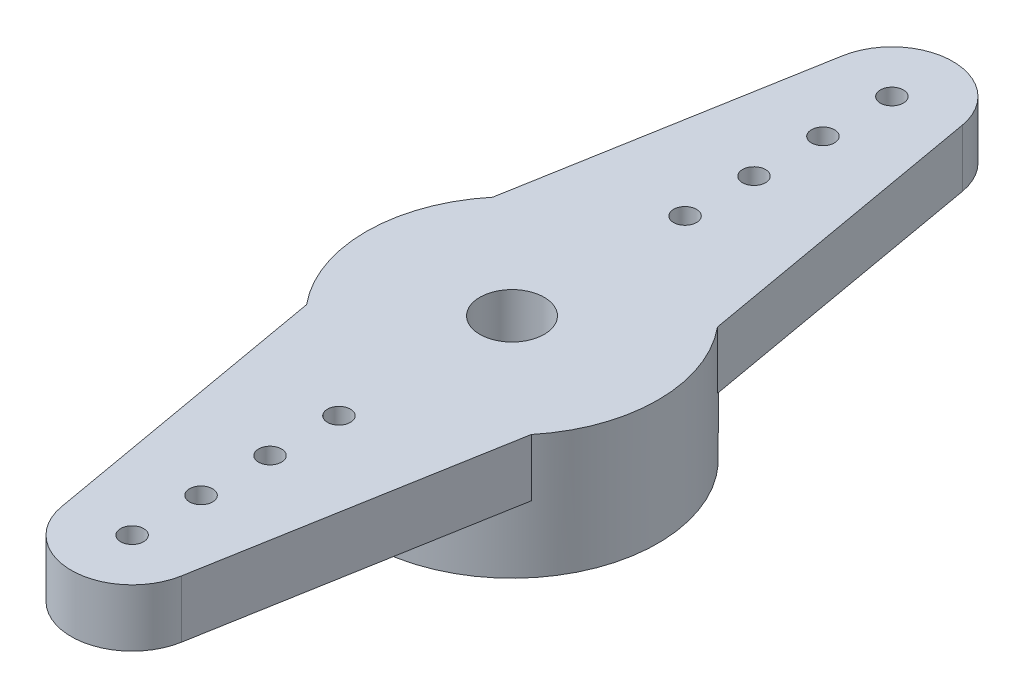
ISO-10303-21;
HEADER;
FILE_DESCRIPTION(('STEP AP214'),'2;1');
FILE_NAME('part.step','',(''),(''),'','','');
FILE_SCHEMA(('AUTOMOTIVE_DESIGN { 1 0 10303 214 1 1 1 1 }'));
ENDSEC;
DATA;
#1=APPLICATION_CONTEXT('core data for automotive mechanical design processes');
#2=APPLICATION_PROTOCOL_DEFINITION('international standard','automotive_design',2000,#1);
#3=PRODUCT_CONTEXT('',#1,'mechanical');
#4=PRODUCT('Part','Part','',(#3));
#5=PRODUCT_RELATED_PRODUCT_CATEGORY('part','',(#4));
#6=PRODUCT_DEFINITION_FORMATION('','',#4);
#7=PRODUCT_DEFINITION_CONTEXT('part definition',#1,'design');
#8=PRODUCT_DEFINITION('design','',#6,#7);
#9=PRODUCT_DEFINITION_SHAPE('','',#8);
#10=(LENGTH_UNIT() NAMED_UNIT(*) SI_UNIT(.MILLI.,.METRE.));
#11=(NAMED_UNIT(*) PLANE_ANGLE_UNIT() SI_UNIT($,.RADIAN.));
#12=(NAMED_UNIT(*) SI_UNIT($,.STERADIAN.) SOLID_ANGLE_UNIT());
#13=UNCERTAINTY_MEASURE_WITH_UNIT(LENGTH_MEASURE(1.E-05),#10,'distance_accuracy_value','');
#14=(GEOMETRIC_REPRESENTATION_CONTEXT(3) GLOBAL_UNCERTAINTY_ASSIGNED_CONTEXT((#13)) GLOBAL_UNIT_ASSIGNED_CONTEXT((#10,
#11,#12)) REPRESENTATION_CONTEXT('',''));
#15=CARTESIAN_POINT('',(0.,0.,0.));
#16=DIRECTION('',(0.,0.,1.));
#17=DIRECTION('',(1.,0.,0.));
#18=AXIS2_PLACEMENT_3D('',#15,#16,#17);
#19=CARTESIAN_POINT('',(0.,5.4,0.));
#20=DIRECTION('',(0.,-1.,0.));
#21=DIRECTION('',(0.,0.,-1.));
#22=AXIS2_PLACEMENT_3D('',#19,#20,#21);
#23=CYLINDRICAL_SURFACE('',#22,6.35);
#24=CARTESIAN_POINT('',(0.,0.,0.));
#25=DIRECTION('',(0.,1.,0.));
#26=DIRECTION('',(0.,0.,1.));
#27=AXIS2_PLACEMENT_3D('',#24,#25,#26);
#28=CIRCLE('',#27,6.35);
#29=CARTESIAN_POINT('',(0.,0.,6.35));
#30=VERTEX_POINT('',#29);
#31=EDGE_CURVE('E182',#30,#30,#28,.T.);
#32=ORIENTED_EDGE('',*,*,#31,.T.);
#33=EDGE_LOOP('',(#32));
#34=FACE_BOUND('',#33,.T.);
#35=DIRECTION('',(0.,1.,0.));
#36=VECTOR('',#35,1.);
#37=CARTESIAN_POINT('',(-4.89161268236577,2.9,4.04902770621767));
#38=LINE('',#37,#36);
#39=CARTESIAN_POINT('',(-4.89161268236577,2.9,4.04902770621767));
#40=VERTEX_POINT('',#39);
#41=CARTESIAN_POINT('',(-4.89161268236577,5.4,4.04902770621767));
#42=VERTEX_POINT('',#41);
#43=EDGE_CURVE('E136',#40,#42,#38,.T.);
#44=ORIENTED_EDGE('',*,*,#43,.T.);
#45=CARTESIAN_POINT('',(0.,5.4,0.));
#46=DIRECTION('',(0.,1.,0.));
#47=DIRECTION('',(0.,0.,1.));
#48=AXIS2_PLACEMENT_3D('',#45,#46,#47);
#49=CIRCLE('',#48,6.35);
#50=CARTESIAN_POINT('',(-4.89161268236577,5.4,-4.04902770621767));
#51=VERTEX_POINT('',#50);
#52=EDGE_CURVE('E11',#51,#42,#49,.T.);
#53=ORIENTED_EDGE('',*,*,#52,.F.);
#54=DIRECTION('',(0.,1.,0.));
#55=VECTOR('',#54,1.);
#56=CARTESIAN_POINT('',(-4.89161268236577,2.9,-4.04902770621767));
#57=LINE('',#56,#55);
#58=CARTESIAN_POINT('',(-4.89161268236577,2.9,-4.04902770621767));
#59=VERTEX_POINT('',#58);
#60=EDGE_CURVE('E186',#59,#51,#57,.T.);
#61=ORIENTED_EDGE('',*,*,#60,.F.);
#62=CARTESIAN_POINT('',(0.,2.9,0.));
#63=DIRECTION('',(0.,-1.,0.));
#64=DIRECTION('',(0.,0.,1.));
#65=AXIS2_PLACEMENT_3D('',#62,#63,#64);
#66=CIRCLE('',#65,6.35);
#67=CARTESIAN_POINT('',(4.89161268236577,2.9,-4.04902770621767));
#68=VERTEX_POINT('',#67);
#69=EDGE_CURVE('E169',#59,#68,#66,.T.);
#70=ORIENTED_EDGE('',*,*,#69,.T.);
#71=DIRECTION('',(0.,1.,0.));
#72=VECTOR('',#71,1.);
#73=CARTESIAN_POINT('',(4.89161268236577,2.9,-4.04902770621767));
#74=LINE('',#73,#72);
#75=CARTESIAN_POINT('',(4.89161268236577,5.4,-4.04902770621767));
#76=VERTEX_POINT('',#75);
#77=EDGE_CURVE('E183',#68,#76,#74,.T.);
#78=ORIENTED_EDGE('',*,*,#77,.T.);
#79=CARTESIAN_POINT('',(4.89161268236577,5.4,4.04902770621767));
#80=VERTEX_POINT('',#79);
#81=EDGE_CURVE('E41',#80,#76,#49,.T.);
#82=ORIENTED_EDGE('',*,*,#81,.F.);
#83=DIRECTION('',(0.,1.,0.));
#84=VECTOR('',#83,1.);
#85=CARTESIAN_POINT('',(4.89161268236577,2.9,4.04902770621767));
#86=LINE('',#85,#84);
#87=CARTESIAN_POINT('',(4.89161268236577,2.9,4.04902770621767));
#88=VERTEX_POINT('',#87);
#89=EDGE_CURVE('E115',#88,#80,#86,.T.);
#90=ORIENTED_EDGE('',*,*,#89,.F.);
#91=CARTESIAN_POINT('',(0.,2.9,0.));
#92=DIRECTION('',(0.,1.,0.));
#93=DIRECTION('',(0.,0.,-1.));
#94=AXIS2_PLACEMENT_3D('',#91,#92,#93);
#95=CIRCLE('',#94,6.35);
#96=EDGE_CURVE('E106',#40,#88,#95,.T.);
#97=ORIENTED_EDGE('',*,*,#96,.F.);
#98=EDGE_LOOP('',(#44,#53,#61,#70,#78,#82,#90,#97));
#99=FACE_BOUND('',#98,.T.);
#100=ADVANCED_FACE('F33',(#34,#99),#23,.T.);
#101=CARTESIAN_POINT('',(0.,5.4,0.));
#102=DIRECTION('',(0.,1.,0.));
#103=DIRECTION('',(0.,0.,1.));
#104=AXIS2_PLACEMENT_3D('',#101,#102,#103);
#105=PLANE('',#104);
#106=CARTESIAN_POINT('',(0.,5.4,7.53));
#107=DIRECTION('',(0.,1.,0.));
#108=DIRECTION('',(0.,0.,1.));
#109=AXIS2_PLACEMENT_3D('',#106,#107,#108);
#110=CIRCLE('',#109,0.5);
#111=CARTESIAN_POINT('',(0.,5.4,8.03));
#112=VERTEX_POINT('',#111);
#113=EDGE_CURVE('E215',#112,#112,#110,.T.);
#114=ORIENTED_EDGE('',*,*,#113,.F.);
#115=EDGE_LOOP('',(#114));
#116=FACE_BOUND('',#115,.T.);
#117=CARTESIAN_POINT('',(0.,5.4,10.53));
#118=DIRECTION('',(0.,1.,0.));
#119=DIRECTION('',(0.,0.,1.));
#120=AXIS2_PLACEMENT_3D('',#117,#118,#119);
#121=CIRCLE('',#120,0.5);
#122=CARTESIAN_POINT('',(0.,5.4,11.03));
#123=VERTEX_POINT('',#122);
#124=EDGE_CURVE('E206',#123,#123,#121,.T.);
#125=ORIENTED_EDGE('',*,*,#124,.F.);
#126=EDGE_LOOP('',(#125));
#127=FACE_BOUND('',#126,.T.);
#128=CARTESIAN_POINT('',(0.,5.4,13.53));
#129=DIRECTION('',(0.,1.,0.));
#130=DIRECTION('',(0.,0.,1.));
#131=AXIS2_PLACEMENT_3D('',#128,#129,#130);
#132=CIRCLE('',#131,0.5);
#133=CARTESIAN_POINT('',(0.,5.4,14.03));
#134=VERTEX_POINT('',#133);
#135=EDGE_CURVE('E203',#134,#134,#132,.T.);
#136=ORIENTED_EDGE('',*,*,#135,.F.);
#137=EDGE_LOOP('',(#136));
#138=FACE_BOUND('',#137,.T.);
#139=CARTESIAN_POINT('',(0.,5.4,16.53));
#140=DIRECTION('',(0.,1.,0.));
#141=DIRECTION('',(0.,0.,1.));
#142=AXIS2_PLACEMENT_3D('',#139,#140,#141);
#143=CIRCLE('',#142,0.5);
#144=CARTESIAN_POINT('',(0.,5.4,17.03));
#145=VERTEX_POINT('',#144);
#146=EDGE_CURVE('E125',#145,#145,#143,.T.);
#147=ORIENTED_EDGE('',*,*,#146,.F.);
#148=EDGE_LOOP('',(#147));
#149=FACE_BOUND('',#148,.T.);
#150=CARTESIAN_POINT('',(0.,5.4,-7.53));
#151=DIRECTION('',(0.,-1.,0.));
#152=DIRECTION('',(0.,0.,-1.));
#153=AXIS2_PLACEMENT_3D('',#150,#151,#152);
#154=CIRCLE('',#153,0.5);
#155=CARTESIAN_POINT('',(0.,5.4,-8.03));
#156=VERTEX_POINT('',#155);
#157=EDGE_CURVE('E135',#156,#156,#154,.T.);
#158=ORIENTED_EDGE('',*,*,#157,.T.);
#159=EDGE_LOOP('',(#158));
#160=FACE_BOUND('',#159,.T.);
#161=CARTESIAN_POINT('',(0.,5.4,-10.53));
#162=DIRECTION('',(0.,-1.,0.));
#163=DIRECTION('',(0.,0.,-1.));
#164=AXIS2_PLACEMENT_3D('',#161,#162,#163);
#165=CIRCLE('',#164,0.5);
#166=CARTESIAN_POINT('',(0.,5.4,-11.03));
#167=VERTEX_POINT('',#166);
#168=EDGE_CURVE('E143',#167,#167,#165,.T.);
#169=ORIENTED_EDGE('',*,*,#168,.T.);
#170=EDGE_LOOP('',(#169));
#171=FACE_BOUND('',#170,.T.);
#172=CARTESIAN_POINT('',(0.,5.4,-13.53));
#173=DIRECTION('',(0.,-1.,0.));
#174=DIRECTION('',(0.,0.,-1.));
#175=AXIS2_PLACEMENT_3D('',#172,#173,#174);
#176=CIRCLE('',#175,0.5);
#177=CARTESIAN_POINT('',(0.,5.4,-14.03));
#178=VERTEX_POINT('',#177);
#179=EDGE_CURVE('E147',#178,#178,#176,.T.);
#180=ORIENTED_EDGE('',*,*,#179,.T.);
#181=EDGE_LOOP('',(#180));
#182=FACE_BOUND('',#181,.T.);
#183=CARTESIAN_POINT('',(0.,5.4,-16.53));
#184=DIRECTION('',(0.,-1.,0.));
#185=DIRECTION('',(0.,0.,-1.));
#186=AXIS2_PLACEMENT_3D('',#183,#184,#185);
#187=CIRCLE('',#186,0.5);
#188=CARTESIAN_POINT('',(0.,5.4,-17.03));
#189=VERTEX_POINT('',#188);
#190=EDGE_CURVE('E151',#189,#189,#187,.T.);
#191=ORIENTED_EDGE('',*,*,#190,.T.);
#192=EDGE_LOOP('',(#191));
#193=FACE_BOUND('',#192,.T.);
#194=ORIENTED_EDGE('',*,*,#52,.T.);
#195=DIRECTION('',(-0.173648177666923,0.,-0.984807753012209));
#196=VECTOR('',#195,1.);
#197=CARTESIAN_POINT('',(-2.60974054548235,5.4,16.9901676708173));
#198=LINE('',#197,#196);
#199=CARTESIAN_POINT('',(-2.60974054548235,5.4,16.9901676708173));
#200=VERTEX_POINT('',#199);
#201=EDGE_CURVE('E121',#200,#42,#198,.T.);
#202=ORIENTED_EDGE('',*,*,#201,.F.);
#203=CARTESIAN_POINT('',(0.,5.4,16.53));
#204=DIRECTION('',(0.,-1.,0.));
#205=DIRECTION('',(0.,0.,-1.));
#206=AXIS2_PLACEMENT_3D('',#203,#204,#205);
#207=CIRCLE('',#206,2.65);
#208=CARTESIAN_POINT('',(2.60974054548235,5.4,16.9901676708173));
#209=VERTEX_POINT('',#208);
#210=EDGE_CURVE('E130',#209,#200,#207,.T.);
#211=ORIENTED_EDGE('',*,*,#210,.F.);
#212=DIRECTION('',(-0.173648177666923,0.,0.984807753012209));
#213=VECTOR('',#212,1.);
#214=CARTESIAN_POINT('',(2.60974054548235,5.4,16.9901676708173));
#215=LINE('',#214,#213);
#216=EDGE_CURVE('E49',#80,#209,#215,.T.);
#217=ORIENTED_EDGE('',*,*,#216,.F.);
#218=ORIENTED_EDGE('',*,*,#81,.T.);
#219=DIRECTION('',(-0.173648177666923,0.,-0.984807753012209));
#220=VECTOR('',#219,1.);
#221=CARTESIAN_POINT('',(2.60974054548235,5.4,-16.9901676708173));
#222=LINE('',#221,#220);
#223=CARTESIAN_POINT('',(2.60974054548235,5.4,-16.9901676708173));
#224=VERTEX_POINT('',#223);
#225=EDGE_CURVE('E166',#76,#224,#222,.T.);
#226=ORIENTED_EDGE('',*,*,#225,.T.);
#227=CARTESIAN_POINT('',(0.,5.4,-16.53));
#228=DIRECTION('',(0.,1.,0.));
#229=DIRECTION('',(0.,0.,1.));
#230=AXIS2_PLACEMENT_3D('',#227,#228,#229);
#231=CIRCLE('',#230,2.65);
#232=CARTESIAN_POINT('',(-2.60974054548235,5.4,-16.9901676708173));
#233=VERTEX_POINT('',#232);
#234=EDGE_CURVE('E158',#224,#233,#231,.T.);
#235=ORIENTED_EDGE('',*,*,#234,.T.);
#236=DIRECTION('',(-0.173648177666923,0.,0.984807753012209));
#237=VECTOR('',#236,1.);
#238=CARTESIAN_POINT('',(-2.60974054548235,5.4,-16.9901676708173));
#239=LINE('',#238,#237);
#240=EDGE_CURVE('E55',#233,#51,#239,.T.);
#241=ORIENTED_EDGE('',*,*,#240,.T.);
#242=EDGE_LOOP('',(#194,#202,#211,#217,#218,#226,#235,#241));
#243=FACE_BOUND('',#242,.T.);
#244=CARTESIAN_POINT('',(0.,5.4,0.));
#245=DIRECTION('',(0.,-1.,0.));
#246=DIRECTION('',(0.,0.,-1.));
#247=AXIS2_PLACEMENT_3D('',#244,#245,#246);
#248=CIRCLE('',#247,1.4);
#249=CARTESIAN_POINT('',(0.,5.4,1.4));
#250=VERTEX_POINT('',#249);
#251=EDGE_CURVE('E159',#250,#250,#248,.T.);
#252=ORIENTED_EDGE('',*,*,#251,.T.);
#253=EDGE_LOOP('',(#252));
#254=FACE_BOUND('',#253,.T.);
#255=ADVANCED_FACE('F223',(#116,#127,#138,#149,#160,#171,#182,#193,#243,#254),#105,.T.);
#256=CARTESIAN_POINT('',(0.,0.,0.));
#257=DIRECTION('',(0.,1.,0.));
#258=DIRECTION('',(0.,0.,1.));
#259=AXIS2_PLACEMENT_3D('',#256,#257,#258);
#260=PLANE('',#259);
#261=ORIENTED_EDGE('',*,*,#31,.F.);
#262=EDGE_LOOP('',(#261));
#263=FACE_BOUND('',#262,.T.);
#264=CARTESIAN_POINT('',(0.,0.,0.));
#265=DIRECTION('',(0.,-1.,0.));
#266=DIRECTION('',(0.,0.,-1.));
#267=AXIS2_PLACEMENT_3D('',#264,#265,#266);
#268=CIRCLE('',#267,1.4);
#269=CARTESIAN_POINT('',(0.,0.,1.4));
#270=VERTEX_POINT('',#269);
#271=EDGE_CURVE('E155',#270,#270,#268,.T.);
#272=ORIENTED_EDGE('',*,*,#271,.F.);
#273=EDGE_LOOP('',(#272));
#274=FACE_BOUND('',#273,.T.);
#275=ADVANCED_FACE('F226',(#263,#274),#260,.F.);
#276=CARTESIAN_POINT('',(0.,2.9,-16.53));
#277=DIRECTION('',(0.,1.,0.));
#278=DIRECTION('',(0.,0.,1.));
#279=AXIS2_PLACEMENT_3D('',#276,#277,#278);
#280=CYLINDRICAL_SURFACE('',#279,2.65);
#281=ORIENTED_EDGE('',*,*,#234,.F.);
#282=DIRECTION('',(0.,1.,0.));
#283=VECTOR('',#282,1.);
#284=CARTESIAN_POINT('',(2.60974054548235,2.9,-16.9901676708173));
#285=LINE('',#284,#283);
#286=CARTESIAN_POINT('',(2.60974054548235,2.9,-16.9901676708173));
#287=VERTEX_POINT('',#286);
#288=EDGE_CURVE('E180',#287,#224,#285,.T.);
#289=ORIENTED_EDGE('',*,*,#288,.F.);
#290=CARTESIAN_POINT('',(0.,2.9,-16.53));
#291=DIRECTION('',(0.,1.,0.));
#292=DIRECTION('',(0.,0.,1.));
#293=AXIS2_PLACEMENT_3D('',#290,#291,#292);
#294=CIRCLE('',#293,2.65);
#295=CARTESIAN_POINT('',(-2.60974054548235,2.9,-16.9901676708173));
#296=VERTEX_POINT('',#295);
#297=EDGE_CURVE('E162',#287,#296,#294,.T.);
#298=ORIENTED_EDGE('',*,*,#297,.T.);
#299=DIRECTION('',(0.,1.,0.));
#300=VECTOR('',#299,1.);
#301=CARTESIAN_POINT('',(-2.60974054548235,2.9,-16.9901676708173));
#302=LINE('',#301,#300);
#303=EDGE_CURVE('E175',#296,#233,#302,.T.);
#304=ORIENTED_EDGE('',*,*,#303,.T.);
#305=EDGE_LOOP('',(#281,#289,#298,#304));
#306=FACE_BOUND('',#305,.T.);
#307=ADVANCED_FACE('F310',(#306),#280,.T.);
#308=CARTESIAN_POINT('',(2.60974054548235,2.9,-16.9901676708173));
#309=DIRECTION('',(0.984807753012209,0.,-0.173648177666923));
#310=DIRECTION('',(-0.173648177666923,0.,-0.984807753012209));
#311=AXIS2_PLACEMENT_3D('',#308,#309,#310);
#312=PLANE('',#311);
#313=ORIENTED_EDGE('',*,*,#225,.F.);
#314=ORIENTED_EDGE('',*,*,#77,.F.);
#315=DIRECTION('',(-0.173648177666923,0.,-0.984807753012209));
#316=VECTOR('',#315,1.);
#317=CARTESIAN_POINT('',(2.60974054548235,2.9,-16.9901676708173));
#318=LINE('',#317,#316);
#319=EDGE_CURVE('E172',#68,#287,#318,.T.);
#320=ORIENTED_EDGE('',*,*,#319,.T.);
#321=ORIENTED_EDGE('',*,*,#288,.T.);
#322=EDGE_LOOP('',(#313,#314,#320,#321));
#323=FACE_BOUND('',#322,.T.);
#324=ADVANCED_FACE('F306',(#323),#312,.T.);
#325=CARTESIAN_POINT('',(-2.60974054548235,2.9,-16.9901676708173));
#326=DIRECTION('',(-0.984807753012209,0.,-0.173648177666923));
#327=DIRECTION('',(-0.173648177666923,0.,0.984807753012209));
#328=AXIS2_PLACEMENT_3D('',#325,#326,#327);
#329=PLANE('',#328);
#330=ORIENTED_EDGE('',*,*,#240,.F.);
#331=ORIENTED_EDGE('',*,*,#303,.F.);
#332=DIRECTION('',(-0.173648177666923,0.,0.984807753012209));
#333=VECTOR('',#332,1.);
#334=CARTESIAN_POINT('',(-2.60974054548235,2.9,-16.9901676708173));
#335=LINE('',#334,#333);
#336=EDGE_CURVE('E165',#296,#59,#335,.T.);
#337=ORIENTED_EDGE('',*,*,#336,.T.);
#338=ORIENTED_EDGE('',*,*,#60,.T.);
#339=EDGE_LOOP('',(#330,#331,#337,#338));
#340=FACE_BOUND('',#339,.T.);
#341=ADVANCED_FACE('F258',(#340),#329,.T.);
#342=CARTESIAN_POINT('',(0.,2.9,-16.53));
#343=DIRECTION('',(0.,1.,0.));
#344=DIRECTION('',(0.,0.,1.));
#345=AXIS2_PLACEMENT_3D('',#342,#343,#344);
#346=PLANE('',#345);
#347=CARTESIAN_POINT('',(0.,2.9,-7.53));
#348=DIRECTION('',(0.,1.,0.));
#349=DIRECTION('',(0.,0.,1.));
#350=AXIS2_PLACEMENT_3D('',#347,#348,#349);
#351=CIRCLE('',#350,0.5);
#352=CARTESIAN_POINT('',(0.,2.9,-7.03));
#353=VERTEX_POINT('',#352);
#354=EDGE_CURVE('E142',#353,#353,#351,.T.);
#355=ORIENTED_EDGE('',*,*,#354,.T.);
#356=EDGE_LOOP('',(#355));
#357=FACE_BOUND('',#356,.T.);
#358=CARTESIAN_POINT('',(0.,2.9,-10.53));
#359=DIRECTION('',(0.,1.,0.));
#360=DIRECTION('',(0.,0.,1.));
#361=AXIS2_PLACEMENT_3D('',#358,#359,#360);
#362=CIRCLE('',#361,0.5);
#363=CARTESIAN_POINT('',(0.,2.9,-10.03));
#364=VERTEX_POINT('',#363);
#365=EDGE_CURVE('E146',#364,#364,#362,.T.);
#366=ORIENTED_EDGE('',*,*,#365,.T.);
#367=EDGE_LOOP('',(#366));
#368=FACE_BOUND('',#367,.T.);
#369=CARTESIAN_POINT('',(0.,2.9,-13.53));
#370=DIRECTION('',(0.,1.,0.));
#371=DIRECTION('',(0.,0.,1.));
#372=AXIS2_PLACEMENT_3D('',#369,#370,#371);
#373=CIRCLE('',#372,0.5);
#374=CARTESIAN_POINT('',(0.,2.9,-13.03));
#375=VERTEX_POINT('',#374);
#376=EDGE_CURVE('E150',#375,#375,#373,.T.);
#377=ORIENTED_EDGE('',*,*,#376,.T.);
#378=EDGE_LOOP('',(#377));
#379=FACE_BOUND('',#378,.T.);
#380=CARTESIAN_POINT('',(0.,2.9,-16.53));
#381=DIRECTION('',(0.,1.,0.));
#382=DIRECTION('',(0.,0.,1.));
#383=AXIS2_PLACEMENT_3D('',#380,#381,#382);
#384=CIRCLE('',#383,0.5);
#385=CARTESIAN_POINT('',(0.,2.9,-16.03));
#386=VERTEX_POINT('',#385);
#387=EDGE_CURVE('E154',#386,#386,#384,.T.);
#388=ORIENTED_EDGE('',*,*,#387,.T.);
#389=EDGE_LOOP('',(#388));
#390=FACE_BOUND('',#389,.T.);
#391=ORIENTED_EDGE('',*,*,#297,.F.);
#392=ORIENTED_EDGE('',*,*,#319,.F.);
#393=ORIENTED_EDGE('',*,*,#69,.F.);
#394=ORIENTED_EDGE('',*,*,#336,.F.);
#395=EDGE_LOOP('',(#391,#392,#393,#394));
#396=FACE_BOUND('',#395,.T.);
#397=ADVANCED_FACE('F248',(#357,#368,#379,#390,#396),#346,.F.);
#398=CARTESIAN_POINT('',(0.,0.,0.));
#399=DIRECTION('',(0.,1.,0.));
#400=DIRECTION('',(0.,0.,1.));
#401=AXIS2_PLACEMENT_3D('',#398,#399,#400);
#402=CYLINDRICAL_SURFACE('',#401,1.4);
#403=CARTESIAN_POINT('',(0.,0.,1.4));
#404=CARTESIAN_POINT('',(0.,0.05625,1.4));
#405=CARTESIAN_POINT('',(0.,0.1125,1.4));
#406=CARTESIAN_POINT('',(0.,0.225,1.4));
#407=CARTESIAN_POINT('',(0.,0.28125,1.4));
#408=CARTESIAN_POINT('',(0.,0.39375,1.4));
#409=CARTESIAN_POINT('',(0.,0.45,1.4));
#410=CARTESIAN_POINT('',(0.,0.5625,1.4));
#411=CARTESIAN_POINT('',(0.,0.61875,1.4));
#412=CARTESIAN_POINT('',(0.,0.73125,1.4));
#413=CARTESIAN_POINT('',(0.,0.7875,1.4));
#414=CARTESIAN_POINT('',(0.,0.9,1.4));
#415=CARTESIAN_POINT('',(0.,0.95625,1.4));
#416=CARTESIAN_POINT('',(0.,1.06875,1.4));
#417=CARTESIAN_POINT('',(0.,1.125,1.4));
#418=CARTESIAN_POINT('',(0.,1.2375,1.4));
#419=CARTESIAN_POINT('',(0.,1.29375,1.4));
#420=CARTESIAN_POINT('',(0.,1.40625,1.4));
#421=CARTESIAN_POINT('',(0.,1.4625,1.4));
#422=CARTESIAN_POINT('',(0.,1.575,1.4));
#423=CARTESIAN_POINT('',(0.,1.63125,1.4));
#424=CARTESIAN_POINT('',(0.,1.74375,1.4));
#425=CARTESIAN_POINT('',(0.,1.8,1.4));
#426=CARTESIAN_POINT('',(0.,1.9125,1.4));
#427=CARTESIAN_POINT('',(0.,1.96875,1.4));
#428=CARTESIAN_POINT('',(0.,2.08125,1.4));
#429=CARTESIAN_POINT('',(0.,2.1375,1.4));
#430=CARTESIAN_POINT('',(0.,2.25,1.4));
#431=CARTESIAN_POINT('',(0.,2.30625,1.4));
#432=CARTESIAN_POINT('',(0.,2.41875,1.4));
#433=CARTESIAN_POINT('',(0.,2.475,1.4));
#434=CARTESIAN_POINT('',(0.,2.5875,1.4));
#435=CARTESIAN_POINT('',(0.,2.64375,1.4));
#436=CARTESIAN_POINT('',(0.,2.75625,1.4));
#437=CARTESIAN_POINT('',(0.,2.8125,1.4));
#438=CARTESIAN_POINT('',(0.,2.925,1.4));
#439=CARTESIAN_POINT('',(0.,2.98125,1.4));
#440=CARTESIAN_POINT('',(0.,3.09375,1.4));
#441=CARTESIAN_POINT('',(0.,3.15,1.4));
#442=CARTESIAN_POINT('',(0.,3.2625,1.4));
#443=CARTESIAN_POINT('',(0.,3.31875,1.4));
#444=CARTESIAN_POINT('',(0.,3.43125,1.4));
#445=CARTESIAN_POINT('',(0.,3.4875,1.4));
#446=CARTESIAN_POINT('',(0.,3.6,1.4));
#447=CARTESIAN_POINT('',(0.,3.65625,1.4));
#448=CARTESIAN_POINT('',(0.,3.76875,1.4));
#449=CARTESIAN_POINT('',(0.,3.825,1.4));
#450=CARTESIAN_POINT('',(0.,3.9375,1.4));
#451=CARTESIAN_POINT('',(0.,3.99375,1.4));
#452=CARTESIAN_POINT('',(0.,4.10625,1.4));
#453=CARTESIAN_POINT('',(0.,4.1625,1.4));
#454=CARTESIAN_POINT('',(0.,4.275,1.4));
#455=CARTESIAN_POINT('',(0.,4.33125,1.4));
#456=CARTESIAN_POINT('',(0.,4.44375,1.4));
#457=CARTESIAN_POINT('',(0.,4.5,1.4));
#458=CARTESIAN_POINT('',(0.,4.6125,1.4));
#459=CARTESIAN_POINT('',(0.,4.66875,1.4));
#460=CARTESIAN_POINT('',(0.,4.78125,1.4));
#461=CARTESIAN_POINT('',(0.,4.8375,1.4));
#462=CARTESIAN_POINT('',(0.,4.95,1.4));
#463=CARTESIAN_POINT('',(0.,5.00625,1.4));
#464=CARTESIAN_POINT('',(0.,5.11875,1.4));
#465=CARTESIAN_POINT('',(0.,5.175,1.4));
#466=CARTESIAN_POINT('',(0.,5.2875,1.4));
#467=CARTESIAN_POINT('',(0.,5.34375,1.4));
#468=CARTESIAN_POINT('',(0.,5.4,1.4));
#469=B_SPLINE_CURVE_WITH_KNOTS('',3,(#403,#404,#405,#406,#407,#408,#409,#410,#411,#412,#413,
#414,#415,#416,#417,#418,#419,#420,#421,#422,#423,#424,#425,#426,#427,#428,#429,#430,#431,#432,
#433,#434,#435,#436,#437,#438,#439,#440,#441,#442,#443,#444,#445,#446,#447,#448,#449,#450,#451,
#452,#453,#454,#455,#456,#457,#458,#459,#460,#461,#462,#463,#464,#465,#466,#467,#468),
.UNSPECIFIED.,.F.,.F.,(4,2,2,2,2,2,2,2,2,2,2,2,2,2,2,2,2,2,2,2,2,2,2,2,2,2,2,2,2,2,2,2,4),(0.,
0.16875,0.3375,0.50625,0.675,0.84375,1.0125,1.18125,1.35,1.51875,1.6875,1.85625,2.025,2.19375,
2.3625,2.53125,2.7,2.86875,3.0375,3.20625,3.375,3.54375,3.7125,3.88125,4.05,4.21875,4.3875,
4.55625,4.725,4.89375,5.0625,5.23125,5.4),.UNSPECIFIED.);
#470=EDGE_CURVE('BSEAM245',#270,#250,#469,.T.);
#471=ORIENTED_EDGE('',*,*,#271,.T.);
#472=ORIENTED_EDGE('',*,*,#251,.F.);
#473=ORIENTED_EDGE('',*,*,#470,.T.);
#474=ORIENTED_EDGE('',*,*,#470,.F.);
#475=EDGE_LOOP('',(#471,#473,#472,#474));
#476=FACE_BOUND('',#475,.T.);
#477=ADVANCED_FACE('F245',(#476),#402,.F.);
#478=CARTESIAN_POINT('',(0.,5.4,-16.53));
#479=DIRECTION('',(0.,-1.,0.));
#480=DIRECTION('',(0.,0.,-1.));
#481=AXIS2_PLACEMENT_3D('',#478,#479,#480);
#482=CYLINDRICAL_SURFACE('',#481,0.5);
#483=ORIENTED_EDGE('',*,*,#190,.F.);
#484=EDGE_LOOP('',(#483));
#485=FACE_BOUND('',#484,.T.);
#486=ORIENTED_EDGE('',*,*,#387,.F.);
#487=EDGE_LOOP('',(#486));
#488=FACE_BOUND('',#487,.T.);
#489=ADVANCED_FACE('F247',(#485,#488),#482,.F.);
#490=CARTESIAN_POINT('',(0.,5.4,-13.53));
#491=DIRECTION('',(0.,-1.,0.));
#492=DIRECTION('',(0.,0.,-1.));
#493=AXIS2_PLACEMENT_3D('',#490,#491,#492);
#494=CYLINDRICAL_SURFACE('',#493,0.5);
#495=ORIENTED_EDGE('',*,*,#179,.F.);
#496=EDGE_LOOP('',(#495));
#497=FACE_BOUND('',#496,.T.);
#498=ORIENTED_EDGE('',*,*,#376,.F.);
#499=EDGE_LOOP('',(#498));
#500=FACE_BOUND('',#499,.T.);
#501=ADVANCED_FACE('F255',(#497,#500),#494,.F.);
#502=CARTESIAN_POINT('',(0.,5.4,-10.53));
#503=DIRECTION('',(0.,-1.,0.));
#504=DIRECTION('',(0.,0.,-1.));
#505=AXIS2_PLACEMENT_3D('',#502,#503,#504);
#506=CYLINDRICAL_SURFACE('',#505,0.5);
#507=ORIENTED_EDGE('',*,*,#168,.F.);
#508=EDGE_LOOP('',(#507));
#509=FACE_BOUND('',#508,.T.);
#510=ORIENTED_EDGE('',*,*,#365,.F.);
#511=EDGE_LOOP('',(#510));
#512=FACE_BOUND('',#511,.T.);
#513=ADVANCED_FACE('F285',(#509,#512),#506,.F.);
#514=CARTESIAN_POINT('',(0.,5.4,-7.53));
#515=DIRECTION('',(0.,-1.,0.));
#516=DIRECTION('',(0.,0.,-1.));
#517=AXIS2_PLACEMENT_3D('',#514,#515,#516);
#518=CYLINDRICAL_SURFACE('',#517,0.5);
#519=ORIENTED_EDGE('',*,*,#157,.F.);
#520=EDGE_LOOP('',(#519));
#521=FACE_BOUND('',#520,.T.);
#522=ORIENTED_EDGE('',*,*,#354,.F.);
#523=EDGE_LOOP('',(#522));
#524=FACE_BOUND('',#523,.T.);
#525=ADVANCED_FACE('F278',(#521,#524),#518,.F.);
#526=CARTESIAN_POINT('',(0.,2.9,16.53));
#527=DIRECTION('',(0.,1.,0.));
#528=DIRECTION('',(0.,0.,1.));
#529=AXIS2_PLACEMENT_3D('',#526,#527,#528);
#530=CYLINDRICAL_SURFACE('',#529,2.65);
#531=ORIENTED_EDGE('',*,*,#210,.T.);
#532=DIRECTION('',(0.,1.,0.));
#533=VECTOR('',#532,1.);
#534=CARTESIAN_POINT('',(-2.60974054548235,2.9,16.9901676708173));
#535=LINE('',#534,#533);
#536=CARTESIAN_POINT('',(-2.60974054548235,2.9,16.9901676708173));
#537=VERTEX_POINT('',#536);
#538=EDGE_CURVE('E120',#537,#200,#535,.T.);
#539=ORIENTED_EDGE('',*,*,#538,.F.);
#540=CARTESIAN_POINT('',(0.,2.9,16.53));
#541=DIRECTION('',(0.,-1.,0.));
#542=DIRECTION('',(0.,0.,-1.));
#543=AXIS2_PLACEMENT_3D('',#540,#541,#542);
#544=CIRCLE('',#543,2.65);
#545=CARTESIAN_POINT('',(2.60974054548235,2.9,16.9901676708173));
#546=VERTEX_POINT('',#545);
#547=EDGE_CURVE('E103',#546,#537,#544,.T.);
#548=ORIENTED_EDGE('',*,*,#547,.F.);
#549=DIRECTION('',(0.,1.,0.));
#550=VECTOR('',#549,1.);
#551=CARTESIAN_POINT('',(2.60974054548235,2.9,16.9901676708173));
#552=LINE('',#551,#550);
#553=EDGE_CURVE('E111',#546,#209,#552,.T.);
#554=ORIENTED_EDGE('',*,*,#553,.T.);
#555=EDGE_LOOP('',(#531,#539,#548,#554));
#556=FACE_BOUND('',#555,.T.);
#557=ADVANCED_FACE('F118',(#556),#530,.T.);
#558=CARTESIAN_POINT('',(-2.60974054548235,2.9,16.9901676708173));
#559=DIRECTION('',(0.984807753012209,0.,-0.173648177666923));
#560=DIRECTION('',(-0.173648177666923,0.,-0.984807753012209));
#561=AXIS2_PLACEMENT_3D('',#558,#559,#560);
#562=PLANE('',#561);
#563=ORIENTED_EDGE('',*,*,#201,.T.);
#564=ORIENTED_EDGE('',*,*,#43,.F.);
#565=DIRECTION('',(-0.173648177666923,0.,-0.984807753012209));
#566=VECTOR('',#565,1.);
#567=CARTESIAN_POINT('',(-2.60974054548235,2.9,16.9901676708173));
#568=LINE('',#567,#566);
#569=EDGE_CURVE('E116',#537,#40,#568,.T.);
#570=ORIENTED_EDGE('',*,*,#569,.F.);
#571=ORIENTED_EDGE('',*,*,#538,.T.);
#572=EDGE_LOOP('',(#563,#564,#570,#571));
#573=FACE_BOUND('',#572,.T.);
#574=ADVANCED_FACE('F270',(#573),#562,.F.);
#575=CARTESIAN_POINT('',(2.60974054548235,2.9,16.9901676708173));
#576=DIRECTION('',(-0.984807753012209,0.,-0.173648177666923));
#577=DIRECTION('',(-0.173648177666923,0.,0.984807753012209));
#578=AXIS2_PLACEMENT_3D('',#575,#576,#577);
#579=PLANE('',#578);
#580=ORIENTED_EDGE('',*,*,#216,.T.);
#581=ORIENTED_EDGE('',*,*,#553,.F.);
#582=DIRECTION('',(-0.173648177666923,0.,0.984807753012209));
#583=VECTOR('',#582,1.);
#584=CARTESIAN_POINT('',(2.60974054548235,2.9,16.9901676708173));
#585=LINE('',#584,#583);
#586=EDGE_CURVE('E99',#88,#546,#585,.T.);
#587=ORIENTED_EDGE('',*,*,#586,.F.);
#588=ORIENTED_EDGE('',*,*,#89,.T.);
#589=EDGE_LOOP('',(#580,#581,#587,#588));
#590=FACE_BOUND('',#589,.T.);
#591=ADVANCED_FACE('F112',(#590),#579,.F.);
#592=CARTESIAN_POINT('',(0.,2.9,16.53));
#593=DIRECTION('',(0.,1.,0.));
#594=DIRECTION('',(0.,0.,-1.));
#595=AXIS2_PLACEMENT_3D('',#592,#593,#594);
#596=PLANE('',#595);
#597=CARTESIAN_POINT('',(0.,2.9,7.53));
#598=DIRECTION('',(0.,1.,0.));
#599=DIRECTION('',(0.,0.,1.));
#600=AXIS2_PLACEMENT_3D('',#597,#598,#599);
#601=CIRCLE('',#600,0.5);
#602=CARTESIAN_POINT('',(0.,2.9,8.03));
#603=VERTEX_POINT('',#602);
#604=EDGE_CURVE('E36',#603,#603,#601,.F.);
#605=ORIENTED_EDGE('',*,*,#604,.F.);
#606=EDGE_LOOP('',(#605));
#607=FACE_BOUND('',#606,.T.);
#608=CARTESIAN_POINT('',(0.,2.9,10.53));
#609=DIRECTION('',(0.,1.,0.));
#610=DIRECTION('',(0.,0.,1.));
#611=AXIS2_PLACEMENT_3D('',#608,#609,#610);
#612=CIRCLE('',#611,0.5);
#613=CARTESIAN_POINT('',(0.,2.9,11.03));
#614=VERTEX_POINT('',#613);
#615=EDGE_CURVE('E204',#614,#614,#612,.F.);
#616=ORIENTED_EDGE('',*,*,#615,.F.);
#617=EDGE_LOOP('',(#616));
#618=FACE_BOUND('',#617,.T.);
#619=CARTESIAN_POINT('',(0.,2.9,13.53));
#620=DIRECTION('',(0.,1.,0.));
#621=DIRECTION('',(0.,0.,1.));
#622=AXIS2_PLACEMENT_3D('',#619,#620,#621);
#623=CIRCLE('',#622,0.5);
#624=CARTESIAN_POINT('',(0.,2.9,14.03));
#625=VERTEX_POINT('',#624);
#626=EDGE_CURVE('E201',#625,#625,#623,.F.);
#627=ORIENTED_EDGE('',*,*,#626,.F.);
#628=EDGE_LOOP('',(#627));
#629=FACE_BOUND('',#628,.T.);
#630=CARTESIAN_POINT('',(0.,2.9,16.53));
#631=DIRECTION('',(0.,1.,0.));
#632=DIRECTION('',(0.,0.,1.));
#633=AXIS2_PLACEMENT_3D('',#630,#631,#632);
#634=CIRCLE('',#633,0.5);
#635=CARTESIAN_POINT('',(0.,2.9,17.03));
#636=VERTEX_POINT('',#635);
#637=EDGE_CURVE('E132',#636,#636,#634,.F.);
#638=ORIENTED_EDGE('',*,*,#637,.F.);
#639=EDGE_LOOP('',(#638));
#640=FACE_BOUND('',#639,.T.);
#641=ORIENTED_EDGE('',*,*,#547,.T.);
#642=ORIENTED_EDGE('',*,*,#569,.T.);
#643=ORIENTED_EDGE('',*,*,#96,.T.);
#644=ORIENTED_EDGE('',*,*,#586,.T.);
#645=EDGE_LOOP('',(#641,#642,#643,#644));
#646=FACE_BOUND('',#645,.T.);
#647=ADVANCED_FACE('F101',(#607,#618,#629,#640,#646),#596,.F.);
#648=CARTESIAN_POINT('',(0.,5.4,16.53));
#649=DIRECTION('',(0.,-1.,0.));
#650=DIRECTION('',(0.,0.,-1.));
#651=AXIS2_PLACEMENT_3D('',#648,#649,#650);
#652=CYLINDRICAL_SURFACE('',#651,0.5);
#653=ORIENTED_EDGE('',*,*,#146,.T.);
#654=EDGE_LOOP('',(#653));
#655=FACE_BOUND('',#654,.T.);
#656=ORIENTED_EDGE('',*,*,#637,.T.);
#657=EDGE_LOOP('',(#656));
#658=FACE_BOUND('',#657,.T.);
#659=ADVANCED_FACE('F386',(#655,#658),#652,.F.);
#660=CARTESIAN_POINT('',(0.,5.4,13.53));
#661=DIRECTION('',(0.,-1.,0.));
#662=DIRECTION('',(0.,0.,-1.));
#663=AXIS2_PLACEMENT_3D('',#660,#661,#662);
#664=CYLINDRICAL_SURFACE('',#663,0.5);
#665=ORIENTED_EDGE('',*,*,#135,.T.);
#666=EDGE_LOOP('',(#665));
#667=FACE_BOUND('',#666,.T.);
#668=ORIENTED_EDGE('',*,*,#626,.T.);
#669=EDGE_LOOP('',(#668));
#670=FACE_BOUND('',#669,.T.);
#671=ADVANCED_FACE('F395',(#667,#670),#664,.F.);
#672=CARTESIAN_POINT('',(0.,5.4,10.53));
#673=DIRECTION('',(0.,-1.,0.));
#674=DIRECTION('',(0.,0.,-1.));
#675=AXIS2_PLACEMENT_3D('',#672,#673,#674);
#676=CYLINDRICAL_SURFACE('',#675,0.5);
#677=ORIENTED_EDGE('',*,*,#124,.T.);
#678=EDGE_LOOP('',(#677));
#679=FACE_BOUND('',#678,.T.);
#680=ORIENTED_EDGE('',*,*,#615,.T.);
#681=EDGE_LOOP('',(#680));
#682=FACE_BOUND('',#681,.T.);
#683=ADVANCED_FACE('F404',(#679,#682),#676,.F.);
#684=CARTESIAN_POINT('',(0.,5.4,7.53));
#685=DIRECTION('',(0.,-1.,0.));
#686=DIRECTION('',(0.,0.,-1.));
#687=AXIS2_PLACEMENT_3D('',#684,#685,#686);
#688=CYLINDRICAL_SURFACE('',#687,0.5);
#689=ORIENTED_EDGE('',*,*,#113,.T.);
#690=EDGE_LOOP('',(#689));
#691=FACE_BOUND('',#690,.T.);
#692=ORIENTED_EDGE('',*,*,#604,.T.);
#693=EDGE_LOOP('',(#692));
#694=FACE_BOUND('',#693,.T.);
#695=ADVANCED_FACE('F220',(#691,#694),#688,.F.);
#696=CLOSED_SHELL('',(#100,#255,#275,#307,#324,#341,#397,#477,#489,#501,#513,#525,#557,#574,
#591,#647,#659,#671,#683,#695));
#697=MANIFOLD_SOLID_BREP('B2',#696);
#698=ADVANCED_BREP_SHAPE_REPRESENTATION('',(#18,#697),#14);
#699=SHAPE_DEFINITION_REPRESENTATION(#9,#698);
ENDSEC;
END-ISO-10303-21;
